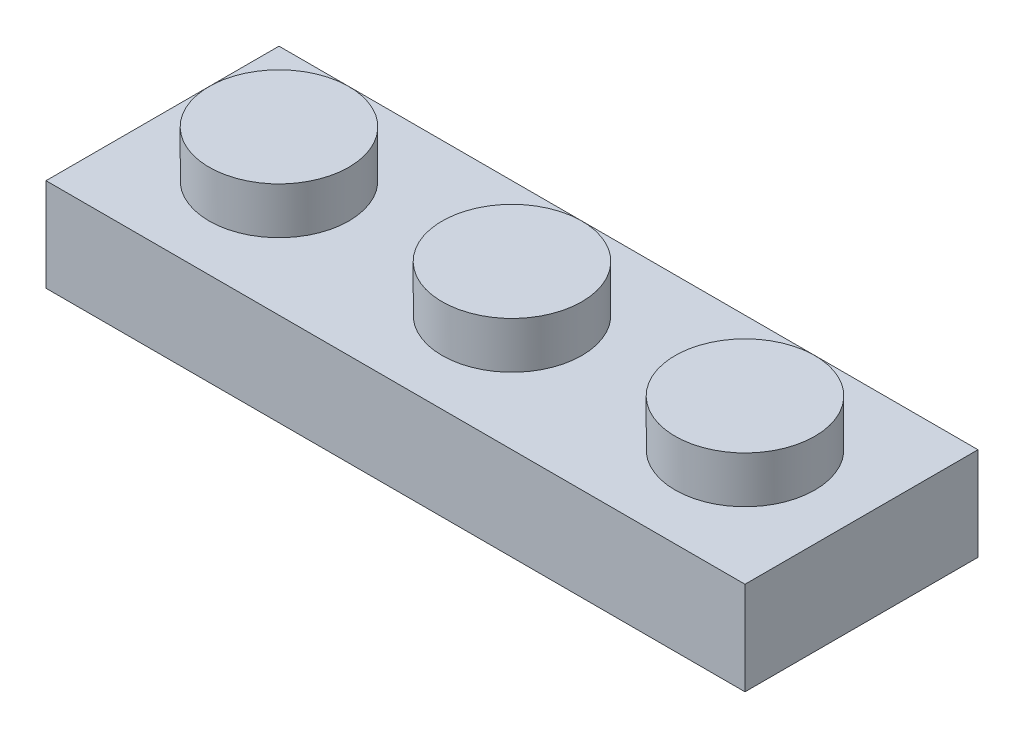
ISO-10303-21;
HEADER;
FILE_DESCRIPTION(('STEP AP214'),'2;1');
FILE_NAME('part.step','',(''),(''),'','','');
FILE_SCHEMA(('AUTOMOTIVE_DESIGN { 1 0 10303 214 1 1 1 1 }'));
ENDSEC;
DATA;
#1=APPLICATION_CONTEXT('core data for automotive mechanical design processes');
#2=APPLICATION_PROTOCOL_DEFINITION('international standard','automotive_design',2000,#1);
#3=PRODUCT_CONTEXT('',#1,'mechanical');
#4=PRODUCT('Part','Part','',(#3));
#5=PRODUCT_RELATED_PRODUCT_CATEGORY('part','',(#4));
#6=PRODUCT_DEFINITION_FORMATION('','',#4);
#7=PRODUCT_DEFINITION_CONTEXT('part definition',#1,'design');
#8=PRODUCT_DEFINITION('design','',#6,#7);
#9=PRODUCT_DEFINITION_SHAPE('','',#8);
#10=(LENGTH_UNIT() NAMED_UNIT(*) SI_UNIT(.MILLI.,.METRE.));
#11=(NAMED_UNIT(*) PLANE_ANGLE_UNIT() SI_UNIT($,.RADIAN.));
#12=(NAMED_UNIT(*) SI_UNIT($,.STERADIAN.) SOLID_ANGLE_UNIT());
#13=UNCERTAINTY_MEASURE_WITH_UNIT(LENGTH_MEASURE(1.E-05),#10,'distance_accuracy_value','');
#14=(GEOMETRIC_REPRESENTATION_CONTEXT(3) GLOBAL_UNCERTAINTY_ASSIGNED_CONTEXT((#13)) GLOBAL_UNIT_ASSIGNED_CONTEXT((#10,
#11,#12)) REPRESENTATION_CONTEXT('',''));
#15=CARTESIAN_POINT('',(0.,0.,0.));
#16=DIRECTION('',(0.,0.,1.));
#17=DIRECTION('',(1.,0.,0.));
#18=AXIS2_PLACEMENT_3D('',#15,#16,#17);
#19=CARTESIAN_POINT('',(20.,1.6,0.));
#20=DIRECTION('',(-1.,0.,0.));
#21=DIRECTION('',(0.,0.,1.));
#22=AXIS2_PLACEMENT_3D('',#19,#20,#21);
#23=PLANE('',#22);
#24=DIRECTION('',(0.,0.,-1.));
#25=VECTOR('',#24,1.);
#26=CARTESIAN_POINT('',(20.,0.,0.));
#27=LINE('',#26,#25);
#28=CARTESIAN_POINT('',(20.,0.,4.));
#29=VERTEX_POINT('',#28);
#30=CARTESIAN_POINT('',(20.,0.,-4.));
#31=VERTEX_POINT('',#30);
#32=EDGE_CURVE('E125',#29,#31,#27,.T.);
#33=ORIENTED_EDGE('',*,*,#32,.T.);
#34=DIRECTION('',(0.,-1.,0.));
#35=VECTOR('',#34,1.);
#36=CARTESIAN_POINT('',(20.,1.6,-4.));
#37=LINE('',#36,#35);
#38=CARTESIAN_POINT('',(20.,3.2,-4.));
#39=VERTEX_POINT('',#38);
#40=EDGE_CURVE('E118',#39,#31,#37,.T.);
#41=ORIENTED_EDGE('',*,*,#40,.F.);
#42=DIRECTION('',(0.,0.,-1.));
#43=VECTOR('',#42,1.);
#44=CARTESIAN_POINT('',(20.,3.2,0.));
#45=LINE('',#44,#43);
#46=CARTESIAN_POINT('',(20.,3.2,4.));
#47=VERTEX_POINT('',#46);
#48=EDGE_CURVE('E11',#47,#39,#45,.T.);
#49=ORIENTED_EDGE('',*,*,#48,.F.);
#50=DIRECTION('',(0.,1.,0.));
#51=VECTOR('',#50,1.);
#52=CARTESIAN_POINT('',(20.,1.6,4.));
#53=LINE('',#52,#51);
#54=EDGE_CURVE('E120',#29,#47,#53,.T.);
#55=ORIENTED_EDGE('',*,*,#54,.F.);
#56=EDGE_LOOP('',(#33,#41,#49,#55));
#57=FACE_BOUND('',#56,.T.);
#58=ADVANCED_FACE('F17',(#57),#23,.F.);
#59=CARTESIAN_POINT('',(8.,3.2,0.));
#60=DIRECTION('',(0.,-1.,0.));
#61=DIRECTION('',(0.,0.,-1.));
#62=AXIS2_PLACEMENT_3D('',#59,#60,#61);
#63=PLANE('',#62);
#64=ORIENTED_EDGE('',*,*,#48,.T.);
#65=DIRECTION('',(1.,0.,0.));
#66=VECTOR('',#65,1.);
#67=CARTESIAN_POINT('',(8.,3.2,-4.));
#68=LINE('',#67,#66);
#69=CARTESIAN_POINT('',(-4.,3.2,-4.));
#70=VERTEX_POINT('',#69);
#71=EDGE_CURVE('E132',#70,#39,#68,.T.);
#72=ORIENTED_EDGE('',*,*,#71,.F.);
#73=DIRECTION('',(0.,0.,-1.));
#74=VECTOR('',#73,1.);
#75=CARTESIAN_POINT('',(-4.,3.2,0.));
#76=LINE('',#75,#74);
#77=CARTESIAN_POINT('',(-4.,3.2,4.));
#78=VERTEX_POINT('',#77);
#79=EDGE_CURVE('E27',#78,#70,#76,.T.);
#80=ORIENTED_EDGE('',*,*,#79,.F.);
#81=DIRECTION('',(-1.,0.,0.));
#82=VECTOR('',#81,1.);
#83=CARTESIAN_POINT('',(8.,3.2,4.));
#84=LINE('',#83,#82);
#85=EDGE_CURVE('E110',#47,#78,#84,.T.);
#86=ORIENTED_EDGE('',*,*,#85,.F.);
#87=EDGE_LOOP('',(#64,#72,#80,#86));
#88=FACE_BOUND('',#87,.T.);
#89=CARTESIAN_POINT('',(0.,3.2,0.));
#90=DIRECTION('',(0.,-1.,0.));
#91=DIRECTION('',(1.,0.,0.));
#92=AXIS2_PLACEMENT_3D('',#89,#90,#91);
#93=CIRCLE('',#92,2.4);
#94=CARTESIAN_POINT('',(-2.4,3.2,0.));
#95=VERTEX_POINT('',#94);
#96=EDGE_CURVE('E114',#95,#95,#93,.T.);
#97=ORIENTED_EDGE('',*,*,#96,.T.);
#98=EDGE_LOOP('',(#97));
#99=FACE_BOUND('',#98,.T.);
#100=CARTESIAN_POINT('',(8.,3.2,0.));
#101=DIRECTION('',(0.,-1.,0.));
#102=DIRECTION('',(1.,0.,0.));
#103=AXIS2_PLACEMENT_3D('',#100,#101,#102);
#104=CIRCLE('',#103,2.4);
#105=CARTESIAN_POINT('',(5.6,3.2,0.));
#106=VERTEX_POINT('',#105);
#107=EDGE_CURVE('E115',#106,#106,#104,.T.);
#108=ORIENTED_EDGE('',*,*,#107,.T.);
#109=EDGE_LOOP('',(#108));
#110=FACE_BOUND('',#109,.T.);
#111=CARTESIAN_POINT('',(16.,3.2,0.));
#112=DIRECTION('',(0.,-1.,0.));
#113=DIRECTION('',(1.,0.,0.));
#114=AXIS2_PLACEMENT_3D('',#111,#112,#113);
#115=CIRCLE('',#114,2.4);
#116=CARTESIAN_POINT('',(13.6,3.2,0.));
#117=VERTEX_POINT('',#116);
#118=EDGE_CURVE('E126',#117,#117,#115,.T.);
#119=ORIENTED_EDGE('',*,*,#118,.T.);
#120=EDGE_LOOP('',(#119));
#121=FACE_BOUND('',#120,.T.);
#122=ADVANCED_FACE('F157',(#88,#99,#110,#121),#63,.F.);
#123=CARTESIAN_POINT('',(-4.,1.6,0.));
#124=DIRECTION('',(1.,0.,0.));
#125=DIRECTION('',(0.,0.,-1.));
#126=AXIS2_PLACEMENT_3D('',#123,#124,#125);
#127=PLANE('',#126);
#128=ORIENTED_EDGE('',*,*,#79,.T.);
#129=DIRECTION('',(0.,1.,0.));
#130=VECTOR('',#129,1.);
#131=CARTESIAN_POINT('',(-4.,1.6,-4.));
#132=LINE('',#131,#130);
#133=CARTESIAN_POINT('',(-4.,0.,-4.));
#134=VERTEX_POINT('',#133);
#135=EDGE_CURVE('E21',#134,#70,#132,.T.);
#136=ORIENTED_EDGE('',*,*,#135,.F.);
#137=DIRECTION('',(0.,0.,-1.));
#138=VECTOR('',#137,1.);
#139=CARTESIAN_POINT('',(-4.,0.,0.));
#140=LINE('',#139,#138);
#141=CARTESIAN_POINT('',(-4.,0.,4.));
#142=VERTEX_POINT('',#141);
#143=EDGE_CURVE('E131',#142,#134,#140,.T.);
#144=ORIENTED_EDGE('',*,*,#143,.F.);
#145=DIRECTION('',(0.,-1.,0.));
#146=VECTOR('',#145,1.);
#147=CARTESIAN_POINT('',(-4.,1.6,4.));
#148=LINE('',#147,#146);
#149=EDGE_CURVE('E106',#78,#142,#148,.T.);
#150=ORIENTED_EDGE('',*,*,#149,.F.);
#151=EDGE_LOOP('',(#128,#136,#144,#150));
#152=FACE_BOUND('',#151,.T.);
#153=ADVANCED_FACE('F149',(#152),#127,.F.);
#154=CARTESIAN_POINT('',(8.,0.,0.));
#155=DIRECTION('',(0.,1.,0.));
#156=DIRECTION('',(0.,0.,1.));
#157=AXIS2_PLACEMENT_3D('',#154,#155,#156);
#158=PLANE('',#157);
#159=ORIENTED_EDGE('',*,*,#143,.T.);
#160=DIRECTION('',(-1.,0.,0.));
#161=VECTOR('',#160,1.);
#162=CARTESIAN_POINT('',(8.,0.,-4.));
#163=LINE('',#162,#161);
#164=EDGE_CURVE('E123',#31,#134,#163,.T.);
#165=ORIENTED_EDGE('',*,*,#164,.F.);
#166=ORIENTED_EDGE('',*,*,#32,.F.);
#167=DIRECTION('',(1.,0.,0.));
#168=VECTOR('',#167,1.);
#169=CARTESIAN_POINT('',(8.,0.,4.));
#170=LINE('',#169,#168);
#171=EDGE_CURVE('E109',#142,#29,#170,.T.);
#172=ORIENTED_EDGE('',*,*,#171,.F.);
#173=EDGE_LOOP('',(#159,#165,#166,#172));
#174=FACE_BOUND('',#173,.T.);
#175=CARTESIAN_POINT('',(0.,0.,0.));
#176=DIRECTION('',(0.,1.,0.));
#177=DIRECTION('',(1.,0.,0.));
#178=AXIS2_PLACEMENT_3D('',#175,#176,#177);
#179=CIRCLE('',#178,2.4);
#180=CARTESIAN_POINT('',(-2.4,0.,0.));
#181=VERTEX_POINT('',#180);
#182=EDGE_CURVE('E81',#181,#181,#179,.T.);
#183=ORIENTED_EDGE('',*,*,#182,.T.);
#184=EDGE_LOOP('',(#183));
#185=FACE_BOUND('',#184,.T.);
#186=CARTESIAN_POINT('',(8.,0.,0.));
#187=DIRECTION('',(0.,1.,0.));
#188=DIRECTION('',(1.,0.,0.));
#189=AXIS2_PLACEMENT_3D('',#186,#187,#188);
#190=CIRCLE('',#189,2.4);
#191=CARTESIAN_POINT('',(5.6,0.,0.));
#192=VERTEX_POINT('',#191);
#193=EDGE_CURVE('E99',#192,#192,#190,.T.);
#194=ORIENTED_EDGE('',*,*,#193,.T.);
#195=EDGE_LOOP('',(#194));
#196=FACE_BOUND('',#195,.T.);
#197=CARTESIAN_POINT('',(16.,0.,0.));
#198=DIRECTION('',(0.,1.,0.));
#199=DIRECTION('',(1.,0.,0.));
#200=AXIS2_PLACEMENT_3D('',#197,#198,#199);
#201=CIRCLE('',#200,2.4);
#202=CARTESIAN_POINT('',(13.6,0.,0.));
#203=VERTEX_POINT('',#202);
#204=EDGE_CURVE('E94',#203,#203,#201,.T.);
#205=ORIENTED_EDGE('',*,*,#204,.T.);
#206=EDGE_LOOP('',(#205));
#207=FACE_BOUND('',#206,.T.);
#208=ADVANCED_FACE('F95',(#174,#185,#196,#207),#158,.F.);
#209=CARTESIAN_POINT('',(8.,1.6,-4.));
#210=DIRECTION('',(0.,0.,1.));
#211=DIRECTION('',(1.,0.,0.));
#212=AXIS2_PLACEMENT_3D('',#209,#210,#211);
#213=PLANE('',#212);
#214=ORIENTED_EDGE('',*,*,#40,.T.);
#215=ORIENTED_EDGE('',*,*,#164,.T.);
#216=ORIENTED_EDGE('',*,*,#135,.T.);
#217=ORIENTED_EDGE('',*,*,#71,.T.);
#218=EDGE_LOOP('',(#214,#215,#216,#217));
#219=FACE_BOUND('',#218,.T.);
#220=ADVANCED_FACE('F147',(#219),#213,.F.);
#221=CARTESIAN_POINT('',(8.,1.6,4.));
#222=DIRECTION('',(0.,0.,1.));
#223=DIRECTION('',(1.,0.,0.));
#224=AXIS2_PLACEMENT_3D('',#221,#222,#223);
#225=PLANE('',#224);
#226=ORIENTED_EDGE('',*,*,#54,.T.);
#227=ORIENTED_EDGE('',*,*,#85,.T.);
#228=ORIENTED_EDGE('',*,*,#149,.T.);
#229=ORIENTED_EDGE('',*,*,#171,.T.);
#230=EDGE_LOOP('',(#226,#227,#228,#229));
#231=FACE_BOUND('',#230,.T.);
#232=ADVANCED_FACE('F154',(#231),#225,.T.);
#233=CARTESIAN_POINT('',(0.,4.8,0.));
#234=DIRECTION('',(0.,1.,0.));
#235=DIRECTION('',(1.,0.,0.));
#236=AXIS2_PLACEMENT_3D('',#233,#234,#235);
#237=PLANE('',#236);
#238=CARTESIAN_POINT('',(0.,4.8,0.));
#239=DIRECTION('',(0.,1.,0.));
#240=DIRECTION('',(1.,0.,0.));
#241=AXIS2_PLACEMENT_3D('',#238,#239,#240);
#242=CIRCLE('',#241,2.4);
#243=CARTESIAN_POINT('',(2.4,4.8,0.));
#244=VERTEX_POINT('',#243);
#245=EDGE_CURVE('E112',#244,#244,#242,.T.);
#246=ORIENTED_EDGE('',*,*,#245,.T.);
#247=EDGE_LOOP('',(#246));
#248=FACE_BOUND('',#247,.T.);
#249=ADVANCED_FACE('F172',(#248),#237,.T.);
#250=CARTESIAN_POINT('',(0.,3.75,0.));
#251=DIRECTION('',(0.,-1.,0.));
#252=DIRECTION('',(1.,0.,0.));
#253=AXIS2_PLACEMENT_3D('',#250,#251,#252);
#254=CYLINDRICAL_SURFACE('',#253,2.4);
#255=ORIENTED_EDGE('',*,*,#96,.F.);
#256=EDGE_LOOP('',(#255));
#257=FACE_BOUND('',#256,.T.);
#258=ORIENTED_EDGE('',*,*,#245,.F.);
#259=EDGE_LOOP('',(#258));
#260=FACE_BOUND('',#259,.T.);
#261=ADVANCED_FACE('F170',(#257,#260),#254,.T.);
#262=CARTESIAN_POINT('',(8.,4.8,0.));
#263=DIRECTION('',(0.,1.,0.));
#264=DIRECTION('',(1.,0.,0.));
#265=AXIS2_PLACEMENT_3D('',#262,#263,#264);
#266=PLANE('',#265);
#267=CARTESIAN_POINT('',(8.,4.8,0.));
#268=DIRECTION('',(0.,1.,0.));
#269=DIRECTION('',(1.,0.,0.));
#270=AXIS2_PLACEMENT_3D('',#267,#268,#269);
#271=CIRCLE('',#270,2.4);
#272=CARTESIAN_POINT('',(10.4,4.8,0.));
#273=VERTEX_POINT('',#272);
#274=EDGE_CURVE('E128',#273,#273,#271,.T.);
#275=ORIENTED_EDGE('',*,*,#274,.T.);
#276=EDGE_LOOP('',(#275));
#277=FACE_BOUND('',#276,.T.);
#278=ADVANCED_FACE('F216',(#277),#266,.T.);
#279=CARTESIAN_POINT('',(8.,3.75,0.));
#280=DIRECTION('',(0.,-1.,0.));
#281=DIRECTION('',(1.,0.,0.));
#282=AXIS2_PLACEMENT_3D('',#279,#280,#281);
#283=CYLINDRICAL_SURFACE('',#282,2.4);
#284=ORIENTED_EDGE('',*,*,#107,.F.);
#285=EDGE_LOOP('',(#284));
#286=FACE_BOUND('',#285,.T.);
#287=ORIENTED_EDGE('',*,*,#274,.F.);
#288=EDGE_LOOP('',(#287));
#289=FACE_BOUND('',#288,.T.);
#290=ADVANCED_FACE('F199',(#286,#289),#283,.T.);
#291=CARTESIAN_POINT('',(16.,4.8,0.));
#292=DIRECTION('',(0.,1.,0.));
#293=DIRECTION('',(1.,0.,0.));
#294=AXIS2_PLACEMENT_3D('',#291,#292,#293);
#295=PLANE('',#294);
#296=CARTESIAN_POINT('',(16.,4.8,0.));
#297=DIRECTION('',(0.,1.,0.));
#298=DIRECTION('',(1.,0.,0.));
#299=AXIS2_PLACEMENT_3D('',#296,#297,#298);
#300=CIRCLE('',#299,2.4);
#301=CARTESIAN_POINT('',(18.4,4.8,0.));
#302=VERTEX_POINT('',#301);
#303=EDGE_CURVE('E102',#302,#302,#300,.T.);
#304=ORIENTED_EDGE('',*,*,#303,.T.);
#305=EDGE_LOOP('',(#304));
#306=FACE_BOUND('',#305,.T.);
#307=ADVANCED_FACE('F205',(#306),#295,.T.);
#308=CARTESIAN_POINT('',(16.,3.75,0.));
#309=DIRECTION('',(0.,-1.,0.));
#310=DIRECTION('',(1.,0.,0.));
#311=AXIS2_PLACEMENT_3D('',#308,#309,#310);
#312=CYLINDRICAL_SURFACE('',#311,2.4);
#313=ORIENTED_EDGE('',*,*,#118,.F.);
#314=EDGE_LOOP('',(#313));
#315=FACE_BOUND('',#314,.T.);
#316=ORIENTED_EDGE('',*,*,#303,.F.);
#317=EDGE_LOOP('',(#316));
#318=FACE_BOUND('',#317,.T.);
#319=ADVANCED_FACE('F203',(#315,#318),#312,.T.);
#320=CARTESIAN_POINT('',(0.,1.6,0.));
#321=DIRECTION('',(0.,1.,0.));
#322=DIRECTION('',(1.,0.,0.));
#323=AXIS2_PLACEMENT_3D('',#320,#321,#322);
#324=PLANE('',#323);
#325=CARTESIAN_POINT('',(0.,1.6,0.));
#326=DIRECTION('',(0.,1.,0.));
#327=DIRECTION('',(1.,0.,0.));
#328=AXIS2_PLACEMENT_3D('',#325,#326,#327);
#329=CIRCLE('',#328,2.4);
#330=CARTESIAN_POINT('',(2.4,1.6,0.));
#331=VERTEX_POINT('',#330);
#332=EDGE_CURVE('E85',#331,#331,#329,.T.);
#333=ORIENTED_EDGE('',*,*,#332,.F.);
#334=EDGE_LOOP('',(#333));
#335=FACE_BOUND('',#334,.T.);
#336=ADVANCED_FACE('F19',(#335),#324,.F.);
#337=CARTESIAN_POINT('',(0.,0.55,0.));
#338=DIRECTION('',(0.,-1.,0.));
#339=DIRECTION('',(1.,0.,0.));
#340=AXIS2_PLACEMENT_3D('',#337,#338,#339);
#341=CYLINDRICAL_SURFACE('',#340,2.4);
#342=ORIENTED_EDGE('',*,*,#332,.T.);
#343=EDGE_LOOP('',(#342));
#344=FACE_BOUND('',#343,.T.);
#345=ORIENTED_EDGE('',*,*,#182,.F.);
#346=EDGE_LOOP('',(#345));
#347=FACE_BOUND('',#346,.T.);
#348=ADVANCED_FACE('F193',(#344,#347),#341,.F.);
#349=CARTESIAN_POINT('',(8.,1.6,0.));
#350=DIRECTION('',(0.,1.,0.));
#351=DIRECTION('',(1.,0.,0.));
#352=AXIS2_PLACEMENT_3D('',#349,#350,#351);
#353=PLANE('',#352);
#354=CARTESIAN_POINT('',(8.,1.6,0.));
#355=DIRECTION('',(0.,1.,0.));
#356=DIRECTION('',(1.,0.,0.));
#357=AXIS2_PLACEMENT_3D('',#354,#355,#356);
#358=CIRCLE('',#357,2.4);
#359=CARTESIAN_POINT('',(10.4,1.6,0.));
#360=VERTEX_POINT('',#359);
#361=EDGE_CURVE('E104',#360,#360,#358,.T.);
#362=ORIENTED_EDGE('',*,*,#361,.F.);
#363=EDGE_LOOP('',(#362));
#364=FACE_BOUND('',#363,.T.);
#365=ADVANCED_FACE('F186',(#364),#353,.F.);
#366=CARTESIAN_POINT('',(8.,0.55,0.));
#367=DIRECTION('',(0.,-1.,0.));
#368=DIRECTION('',(1.,0.,0.));
#369=AXIS2_PLACEMENT_3D('',#366,#367,#368);
#370=CYLINDRICAL_SURFACE('',#369,2.4);
#371=ORIENTED_EDGE('',*,*,#361,.T.);
#372=EDGE_LOOP('',(#371));
#373=FACE_BOUND('',#372,.T.);
#374=ORIENTED_EDGE('',*,*,#193,.F.);
#375=EDGE_LOOP('',(#374));
#376=FACE_BOUND('',#375,.T.);
#377=ADVANCED_FACE('F178',(#373,#376),#370,.F.);
#378=CARTESIAN_POINT('',(16.,1.6,0.));
#379=DIRECTION('',(0.,1.,0.));
#380=DIRECTION('',(1.,0.,0.));
#381=AXIS2_PLACEMENT_3D('',#378,#379,#380);
#382=PLANE('',#381);
#383=CARTESIAN_POINT('',(16.,1.6,0.));
#384=DIRECTION('',(0.,1.,0.));
#385=DIRECTION('',(1.,0.,0.));
#386=AXIS2_PLACEMENT_3D('',#383,#384,#385);
#387=CIRCLE('',#386,2.4);
#388=CARTESIAN_POINT('',(18.4,1.6,0.));
#389=VERTEX_POINT('',#388);
#390=EDGE_CURVE('E97',#389,#389,#387,.T.);
#391=ORIENTED_EDGE('',*,*,#390,.F.);
#392=EDGE_LOOP('',(#391));
#393=FACE_BOUND('',#392,.T.);
#394=ADVANCED_FACE('F175',(#393),#382,.F.);
#395=CARTESIAN_POINT('',(16.,0.55,0.));
#396=DIRECTION('',(0.,-1.,0.));
#397=DIRECTION('',(1.,0.,0.));
#398=AXIS2_PLACEMENT_3D('',#395,#396,#397);
#399=CYLINDRICAL_SURFACE('',#398,2.4);
#400=ORIENTED_EDGE('',*,*,#390,.T.);
#401=EDGE_LOOP('',(#400));
#402=FACE_BOUND('',#401,.T.);
#403=ORIENTED_EDGE('',*,*,#204,.F.);
#404=EDGE_LOOP('',(#403));
#405=FACE_BOUND('',#404,.T.);
#406=ADVANCED_FACE('F177',(#402,#405),#399,.F.);
#407=CLOSED_SHELL('',(#58,#122,#153,#208,#220,#232,#249,#261,#278,#290,#307,#319,#336,#348,#365,
#377,#394,#406));
#408=MANIFOLD_SOLID_BREP('B1',#407);
#409=ADVANCED_BREP_SHAPE_REPRESENTATION('',(#18,#408),#14);
#410=SHAPE_DEFINITION_REPRESENTATION(#9,#409);
ENDSEC;
END-ISO-10303-21;
